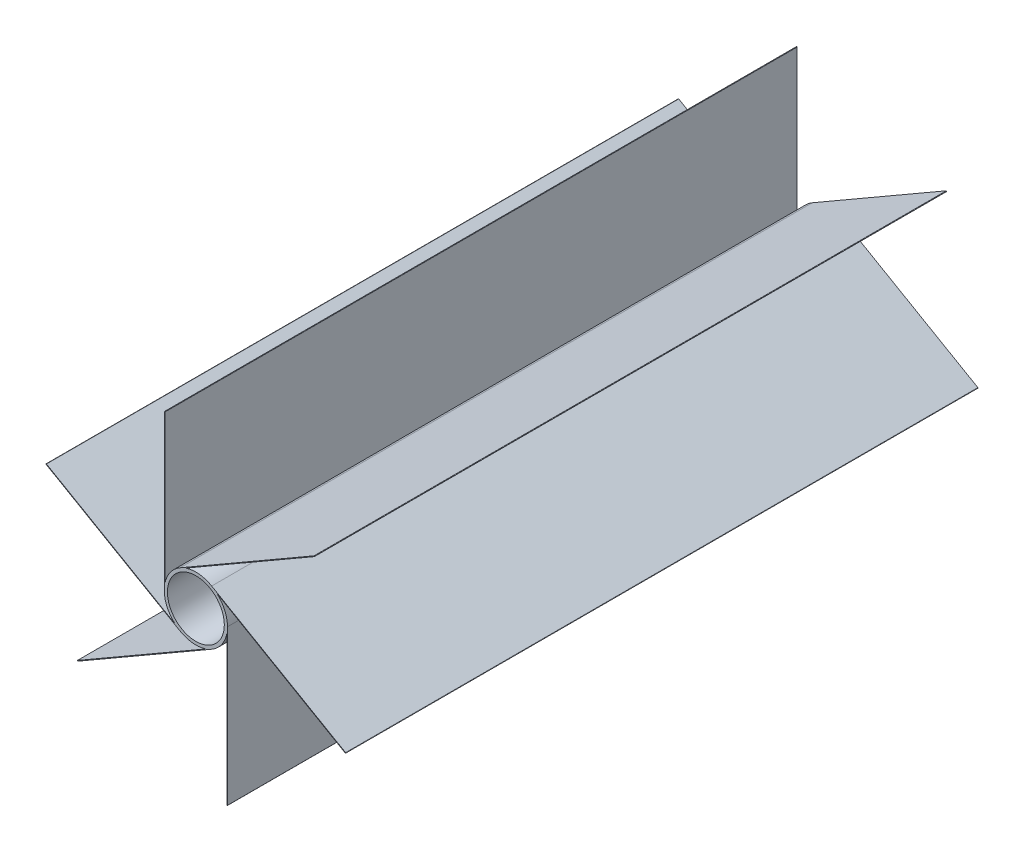
ISO-10303-21;
HEADER;
FILE_DESCRIPTION(('STEP AP214'),'2;1');
FILE_NAME('part.step','',(''),(''),'','','');
FILE_SCHEMA(('AUTOMOTIVE_DESIGN { 1 0 10303 214 1 1 1 1 }'));
ENDSEC;
DATA;
#1=APPLICATION_CONTEXT('core data for automotive mechanical design processes');
#2=APPLICATION_PROTOCOL_DEFINITION('international standard','automotive_design',2000,#1);
#3=PRODUCT_CONTEXT('',#1,'mechanical');
#4=PRODUCT('Part','Part','',(#3));
#5=PRODUCT_RELATED_PRODUCT_CATEGORY('part','',(#4));
#6=PRODUCT_DEFINITION_FORMATION('','',#4);
#7=PRODUCT_DEFINITION_CONTEXT('part definition',#1,'design');
#8=PRODUCT_DEFINITION('design','',#6,#7);
#9=PRODUCT_DEFINITION_SHAPE('','',#8);
#10=(LENGTH_UNIT() NAMED_UNIT(*) SI_UNIT(.MILLI.,.METRE.));
#11=(NAMED_UNIT(*) PLANE_ANGLE_UNIT() SI_UNIT($,.RADIAN.));
#12=(NAMED_UNIT(*) SI_UNIT($,.STERADIAN.) SOLID_ANGLE_UNIT());
#13=UNCERTAINTY_MEASURE_WITH_UNIT(LENGTH_MEASURE(1.E-05),#10,'distance_accuracy_value','');
#14=(GEOMETRIC_REPRESENTATION_CONTEXT(3) GLOBAL_UNCERTAINTY_ASSIGNED_CONTEXT((#13)) GLOBAL_UNIT_ASSIGNED_CONTEXT((#10,
#11,#12)) REPRESENTATION_CONTEXT('',''));
#15=CARTESIAN_POINT('',(0.,0.,0.));
#16=DIRECTION('',(0.,0.,1.));
#17=DIRECTION('',(1.,0.,0.));
#18=AXIS2_PLACEMENT_3D('',#15,#16,#17);
#19=CARTESIAN_POINT('',(0.,0.,-75.));
#20=DIRECTION('',(0.,0.,1.));
#21=DIRECTION('',(1.,0.,0.));
#22=AXIS2_PLACEMENT_3D('',#19,#20,#21);
#23=CYLINDRICAL_SURFACE('',#22,10.);
#24=CARTESIAN_POINT('',(0.,0.,-75.));
#25=DIRECTION('',(0.,0.,-1.));
#26=DIRECTION('',(-1.,0.,0.));
#27=AXIS2_PLACEMENT_3D('',#24,#25,#26);
#28=CIRCLE('',#27,10.);
#29=CARTESIAN_POINT('',(-10.,0.,-75.));
#30=VERTEX_POINT('',#29);
#31=EDGE_CURVE('E11',#30,#30,#28,.T.);
#32=ORIENTED_EDGE('',*,*,#31,.F.);
#33=EDGE_LOOP('',(#32));
#34=FACE_BOUND('',#33,.T.);
#35=CARTESIAN_POINT('',(0.,0.,-27.));
#36=DIRECTION('',(0.,0.,-1.));
#37=DIRECTION('',(-1.,0.,0.));
#38=AXIS2_PLACEMENT_3D('',#35,#36,#37);
#39=CIRCLE('',#38,10.);
#40=CARTESIAN_POINT('',(-10.,0.,-27.));
#41=VERTEX_POINT('',#40);
#42=EDGE_CURVE('E51',#41,#41,#39,.T.);
#43=ORIENTED_EDGE('',*,*,#42,.T.);
#44=EDGE_LOOP('',(#43));
#45=FACE_BOUND('',#44,.T.);
#46=ADVANCED_FACE('F48',(#34,#45),#23,.T.);
#47=CARTESIAN_POINT('',(0.,0.,-75.));
#48=DIRECTION('',(0.,0.,-1.));
#49=DIRECTION('',(-1.,0.,0.));
#50=AXIS2_PLACEMENT_3D('',#47,#48,#49);
#51=PLANE('',#50);
#52=ORIENTED_EDGE('',*,*,#31,.T.);
#53=EDGE_LOOP('',(#52));
#54=FACE_BOUND('',#53,.T.);
#55=ADVANCED_FACE('F63',(#54),#51,.T.);
#56=CARTESIAN_POINT('',(0.,0.,-27.));
#57=DIRECTION('',(0.,0.,-1.));
#58=DIRECTION('',(-1.,0.,0.));
#59=AXIS2_PLACEMENT_3D('',#56,#57,#58);
#60=PLANE('',#59);
#61=ORIENTED_EDGE('',*,*,#42,.F.);
#62=EDGE_LOOP('',(#61));
#63=FACE_BOUND('',#62,.T.);
#64=ADVANCED_FACE('F61',(#63),#60,.F.);
#65=CLOSED_SHELL('',(#46,#55,#64));
#66=MANIFOLD_SOLID_BREP('B2',#65);
#67=CARTESIAN_POINT('',(0.,0.,-27.));
#68=DIRECTION('',(0.,0.,1.));
#69=DIRECTION('',(1.,0.,0.));
#70=AXIS2_PLACEMENT_3D('',#67,#68,#69);
#71=CYLINDRICAL_SURFACE('',#70,12.5);
#72=CARTESIAN_POINT('',(0.,0.,-27.));
#73=DIRECTION('',(0.,0.,-1.));
#74=DIRECTION('',(-1.,0.,0.));
#75=AXIS2_PLACEMENT_3D('',#72,#73,#74);
#76=CIRCLE('',#75,12.5);
#77=CARTESIAN_POINT('',(-12.5,0.,-27.));
#78=VERTEX_POINT('',#77);
#79=EDGE_CURVE('E47',#78,#78,#76,.T.);
#80=ORIENTED_EDGE('',*,*,#79,.F.);
#81=EDGE_LOOP('',(#80));
#82=FACE_BOUND('',#81,.T.);
#83=CARTESIAN_POINT('',(0.,0.,0.));
#84=DIRECTION('',(0.,0.,-1.));
#85=DIRECTION('',(-1.,0.,0.));
#86=AXIS2_PLACEMENT_3D('',#83,#84,#85);
#87=CIRCLE('',#86,12.5);
#88=CARTESIAN_POINT('',(-12.5,0.,0.));
#89=VERTEX_POINT('',#88);
#90=EDGE_CURVE('E103',#89,#89,#87,.T.);
#91=ORIENTED_EDGE('',*,*,#90,.T.);
#92=EDGE_LOOP('',(#91));
#93=FACE_BOUND('',#92,.T.);
#94=ADVANCED_FACE('F100',(#82,#93),#71,.T.);
#95=CARTESIAN_POINT('',(0.,0.,-27.));
#96=DIRECTION('',(0.,0.,-1.));
#97=DIRECTION('',(-1.,0.,0.));
#98=AXIS2_PLACEMENT_3D('',#95,#96,#97);
#99=PLANE('',#98);
#100=ORIENTED_EDGE('',*,*,#79,.T.);
#101=EDGE_LOOP('',(#100));
#102=FACE_BOUND('',#101,.T.);
#103=ADVANCED_FACE('F131',(#102),#99,.T.);
#104=CARTESIAN_POINT('',(0.,0.,10.));
#105=DIRECTION('',(0.,0.,-1.));
#106=DIRECTION('',(-1.,0.,0.));
#107=AXIS2_PLACEMENT_3D('',#104,#105,#106);
#108=CYLINDRICAL_SURFACE('',#107,45.);
#109=CARTESIAN_POINT('',(0.,0.,10.));
#110=DIRECTION('',(0.,0.,-1.));
#111=DIRECTION('',(-1.,0.,0.));
#112=AXIS2_PLACEMENT_3D('',#109,#110,#111);
#113=CIRCLE('',#112,45.);
#114=CARTESIAN_POINT('',(-45.,0.,10.));
#115=VERTEX_POINT('',#114);
#116=EDGE_CURVE('E110',#115,#115,#113,.T.);
#117=ORIENTED_EDGE('',*,*,#116,.T.);
#118=EDGE_LOOP('',(#117));
#119=FACE_BOUND('',#118,.T.);
#120=CARTESIAN_POINT('',(0.,0.,0.));
#121=DIRECTION('',(0.,0.,-1.));
#122=DIRECTION('',(-1.,0.,0.));
#123=AXIS2_PLACEMENT_3D('',#120,#121,#122);
#124=CIRCLE('',#123,45.);
#125=CARTESIAN_POINT('',(-45.,0.,0.));
#126=VERTEX_POINT('',#125);
#127=EDGE_CURVE('E112',#126,#126,#124,.T.);
#128=ORIENTED_EDGE('',*,*,#127,.F.);
#129=EDGE_LOOP('',(#128));
#130=FACE_BOUND('',#129,.T.);
#131=ADVANCED_FACE('F118',(#119,#130),#108,.T.);
#132=CARTESIAN_POINT('',(0.,0.,10.));
#133=DIRECTION('',(0.,0.,-1.));
#134=DIRECTION('',(-1.,0.,0.));
#135=AXIS2_PLACEMENT_3D('',#132,#133,#134);
#136=PLANE('',#135);
#137=ORIENTED_EDGE('',*,*,#116,.F.);
#138=EDGE_LOOP('',(#137));
#139=FACE_BOUND('',#138,.T.);
#140=ADVANCED_FACE('F121',(#139),#136,.F.);
#141=CARTESIAN_POINT('',(0.,0.,0.));
#142=DIRECTION('',(0.,0.,-1.));
#143=DIRECTION('',(-1.,0.,0.));
#144=AXIS2_PLACEMENT_3D('',#141,#142,#143);
#145=PLANE('',#144);
#146=ORIENTED_EDGE('',*,*,#90,.F.);
#147=EDGE_LOOP('',(#146));
#148=FACE_BOUND('',#147,.T.);
#149=ORIENTED_EDGE('',*,*,#127,.T.);
#150=EDGE_LOOP('',(#149));
#151=FACE_BOUND('',#150,.T.);
#152=ADVANCED_FACE('F123',(#148,#151),#145,.T.);
#153=CLOSED_SHELL('',(#94,#103,#131,#140,#152));
#154=MANIFOLD_SOLID_BREP('B6',#153);
#155=CARTESIAN_POINT('',(-49.5,244.54038521275,1000.));
#156=DIRECTION('',(0.,0.,1.));
#157=DIRECTION('',(1.,0.,0.));
#158=AXIS2_PLACEMENT_3D('',#155,#156,#157);
#159=PLANE('',#158);
#160=CARTESIAN_POINT('',(-49.5,244.54038521275,1000.));
#161=DIRECTION('',(0.,0.,1.));
#162=DIRECTION('',(1.,0.,0.));
#163=AXIS2_PLACEMENT_3D('',#160,#161,#162);
#164=CIRCLE('',#163,0.500000000000004);
#165=CARTESIAN_POINT('',(-49.,244.54038521275,1000.));
#166=VERTEX_POINT('',#165);
#167=CARTESIAN_POINT('',(-50.,244.54038521275,1000.));
#168=VERTEX_POINT('',#167);
#169=EDGE_CURVE('E413',#166,#168,#164,.T.);
#170=ORIENTED_EDGE('',*,*,#169,.T.);
#171=DIRECTION('',(0.,-1.,0.));
#172=VECTOR('',#171,1.);
#173=CARTESIAN_POINT('',(-50.,0.,1000.));
#174=LINE('',#173,#172);
#175=CARTESIAN_POINT('',(-50.,0.,1000.));
#176=VERTEX_POINT('',#175);
#177=EDGE_CURVE('E281',#168,#176,#174,.T.);
#178=ORIENTED_EDGE('',*,*,#177,.T.);
#179=CARTESIAN_POINT('',(0.,0.,1000.));
#180=DIRECTION('',(0.,0.,1.));
#181=DIRECTION('',(1.,0.,0.));
#182=AXIS2_PLACEMENT_3D('',#179,#180,#181);
#183=CIRCLE('',#182,50.);
#184=CARTESIAN_POINT('',(-33.116843969807,-37.4603075999044,1000.));
#185=VERTEX_POINT('',#184);
#186=EDGE_CURVE('E476',#176,#185,#183,.T.);
#187=ORIENTED_EDGE('',*,*,#186,.T.);
#188=DIRECTION('',(-0.866025403784439,0.499999999999999,0.));
#189=VECTOR('',#188,1.);
#190=CARTESIAN_POINT('',(-33.116843969807,-37.4603075999044,1000.));
#191=LINE('',#190,#189);
#192=CARTESIAN_POINT('',(-236.278185845474,79.8349478209371,1000.));
#193=VERTEX_POINT('',#192);
#194=EDGE_CURVE('E495',#185,#193,#191,.T.);
#195=ORIENTED_EDGE('',*,*,#194,.T.);
#196=CARTESIAN_POINT('',(-236.528185845474,79.4019351190449,1000.));
#197=DIRECTION('',(0.,0.,1.));
#198=DIRECTION('',(1.,0.,0.));
#199=AXIS2_PLACEMENT_3D('',#196,#197,#198);
#200=CIRCLE('',#199,0.500000000000009);
#201=CARTESIAN_POINT('',(-236.778185845474,78.9689224171527,1000.));
#202=VERTEX_POINT('',#201);
#203=EDGE_CURVE('E492',#193,#202,#200,.T.);
#204=ORIENTED_EDGE('',*,*,#203,.T.);
#205=DIRECTION('',(0.866025403784439,-0.499999999999999,0.));
#206=VECTOR('',#205,1.);
#207=CARTESIAN_POINT('',(-25.,-43.301270189222,1000.));
#208=LINE('',#207,#206);
#209=CARTESIAN_POINT('',(-25.,-43.3012701892219,1000.));
#210=VERTEX_POINT('',#209);
#211=EDGE_CURVE('E494',#202,#210,#208,.T.);
#212=ORIENTED_EDGE('',*,*,#211,.T.);
#213=CARTESIAN_POINT('',(0.,0.,1000.));
#214=DIRECTION('',(0.,0.,1.));
#215=DIRECTION('',(1.,0.,0.));
#216=AXIS2_PLACEMENT_3D('',#213,#214,#215);
#217=CIRCLE('',#216,50.);
#218=CARTESIAN_POINT('',(15.883156030193,-47.4101819709706,1000.));
#219=VERTEX_POINT('',#218);
#220=EDGE_CURVE('E497',#210,#219,#217,.T.);
#221=ORIENTED_EDGE('',*,*,#220,.T.);
#222=DIRECTION('',(-0.866025403784438,-0.5,0.));
#223=VECTOR('',#222,1.);
#224=CARTESIAN_POINT('',(15.883156030193,-47.4101819709706,1000.));
#225=LINE('',#224,#223);
#226=CARTESIAN_POINT('',(-187.278185845474,-164.705437391812,1000.));
#227=VERTEX_POINT('',#226);
#228=EDGE_CURVE('E503',#219,#227,#225,.T.);
#229=ORIENTED_EDGE('',*,*,#228,.T.);
#230=CARTESIAN_POINT('',(-187.028185845474,-165.138450093705,1000.));
#231=DIRECTION('',(0.,0.,1.));
#232=DIRECTION('',(1.,0.,0.));
#233=AXIS2_PLACEMENT_3D('',#230,#231,#232);
#234=CIRCLE('',#233,0.500000000000021);
#235=CARTESIAN_POINT('',(-186.778185845474,-165.571462795597,1000.));
#236=VERTEX_POINT('',#235);
#237=EDGE_CURVE('E505',#227,#236,#234,.T.);
#238=ORIENTED_EDGE('',*,*,#237,.T.);
#239=DIRECTION('',(0.866025403784438,0.500000000000001,0.));
#240=VECTOR('',#239,1.);
#241=CARTESIAN_POINT('',(25.,-43.3012701892219,1000.));
#242=LINE('',#241,#240);
#243=CARTESIAN_POINT('',(25.,-43.3012701892219,1000.));
#244=VERTEX_POINT('',#243);
#245=EDGE_CURVE('E507',#236,#244,#242,.T.);
#246=ORIENTED_EDGE('',*,*,#245,.T.);
#247=CARTESIAN_POINT('',(0.,0.,1000.));
#248=DIRECTION('',(0.,0.,1.));
#249=DIRECTION('',(1.,0.,0.));
#250=AXIS2_PLACEMENT_3D('',#247,#248,#249);
#251=CIRCLE('',#250,50.);
#252=CARTESIAN_POINT('',(49.,-9.9498743710662,1000.));
#253=VERTEX_POINT('',#252);
#254=EDGE_CURVE('E509',#244,#253,#251,.T.);
#255=ORIENTED_EDGE('',*,*,#254,.T.);
#256=DIRECTION('',(0.,-1.,0.));
#257=VECTOR('',#256,1.);
#258=CARTESIAN_POINT('',(49.,-9.9498743710662,1000.));
#259=LINE('',#258,#257);
#260=CARTESIAN_POINT('',(49.,-244.54038521275,1000.));
#261=VERTEX_POINT('',#260);
#262=EDGE_CURVE('E511',#253,#261,#259,.T.);
#263=ORIENTED_EDGE('',*,*,#262,.T.);
#264=CARTESIAN_POINT('',(49.5,-244.54038521275,1000.));
#265=DIRECTION('',(0.,0.,1.));
#266=DIRECTION('',(1.,0.,0.));
#267=AXIS2_PLACEMENT_3D('',#264,#265,#266);
#268=CIRCLE('',#267,0.500000000000004);
#269=CARTESIAN_POINT('',(50.,-244.54038521275,1000.));
#270=VERTEX_POINT('',#269);
#271=EDGE_CURVE('E513',#261,#270,#268,.T.);
#272=ORIENTED_EDGE('',*,*,#271,.T.);
#273=DIRECTION('',(0.,1.,0.));
#274=VECTOR('',#273,1.);
#275=CARTESIAN_POINT('',(50.,0.,1000.));
#276=LINE('',#275,#274);
#277=CARTESIAN_POINT('',(50.,0.,1000.));
#278=VERTEX_POINT('',#277);
#279=EDGE_CURVE('E515',#270,#278,#276,.T.);
#280=ORIENTED_EDGE('',*,*,#279,.T.);
#281=CARTESIAN_POINT('',(0.,0.,1000.));
#282=DIRECTION('',(0.,0.,1.));
#283=DIRECTION('',(1.,0.,0.));
#284=AXIS2_PLACEMENT_3D('',#281,#282,#283);
#285=CIRCLE('',#284,50.);
#286=CARTESIAN_POINT('',(33.116843969807,37.4603075999044,1000.));
#287=VERTEX_POINT('',#286);
#288=EDGE_CURVE('E517',#278,#287,#285,.T.);
#289=ORIENTED_EDGE('',*,*,#288,.T.);
#290=DIRECTION('',(0.866025403784439,-0.5,0.));
#291=VECTOR('',#290,1.);
#292=CARTESIAN_POINT('',(33.116843969807,37.4603075999044,1000.));
#293=LINE('',#292,#291);
#294=CARTESIAN_POINT('',(236.278185845474,-79.8349478209373,1000.));
#295=VERTEX_POINT('',#294);
#296=EDGE_CURVE('E519',#287,#295,#293,.T.);
#297=ORIENTED_EDGE('',*,*,#296,.T.);
#298=CARTESIAN_POINT('',(236.528185845474,-79.4019351190451,1000.));
#299=DIRECTION('',(0.,0.,1.));
#300=DIRECTION('',(1.,0.,0.));
#301=AXIS2_PLACEMENT_3D('',#298,#299,#300);
#302=CIRCLE('',#301,0.500000000000008);
#303=CARTESIAN_POINT('',(236.778185845474,-78.9689224171528,1000.));
#304=VERTEX_POINT('',#303);
#305=EDGE_CURVE('E521',#295,#304,#302,.T.);
#306=ORIENTED_EDGE('',*,*,#305,.T.);
#307=DIRECTION('',(-0.866025403784439,0.5,0.));
#308=VECTOR('',#307,1.);
#309=CARTESIAN_POINT('',(25.,43.3012701892219,1000.));
#310=LINE('',#309,#308);
#311=CARTESIAN_POINT('',(25.,43.3012701892219,1000.));
#312=VERTEX_POINT('',#311);
#313=EDGE_CURVE('E523',#304,#312,#310,.T.);
#314=ORIENTED_EDGE('',*,*,#313,.T.);
#315=CARTESIAN_POINT('',(0.,0.,1000.));
#316=DIRECTION('',(0.,0.,1.));
#317=DIRECTION('',(1.,0.,0.));
#318=AXIS2_PLACEMENT_3D('',#315,#316,#317);
#319=CIRCLE('',#318,50.);
#320=CARTESIAN_POINT('',(-15.883156030193,47.4101819709706,1000.));
#321=VERTEX_POINT('',#320);
#322=EDGE_CURVE('E525',#312,#321,#319,.T.);
#323=ORIENTED_EDGE('',*,*,#322,.T.);
#324=DIRECTION('',(0.866025403784439,0.5,0.));
#325=VECTOR('',#324,1.);
#326=CARTESIAN_POINT('',(-15.883156030193,47.4101819709706,1000.));
#327=LINE('',#326,#325);
#328=CARTESIAN_POINT('',(187.278185845474,164.705437391812,1000.));
#329=VERTEX_POINT('',#328);
#330=EDGE_CURVE('E527',#321,#329,#327,.T.);
#331=ORIENTED_EDGE('',*,*,#330,.T.);
#332=CARTESIAN_POINT('',(187.028185845474,165.138450093705,1000.));
#333=DIRECTION('',(0.,0.,1.));
#334=DIRECTION('',(1.,0.,0.));
#335=AXIS2_PLACEMENT_3D('',#332,#333,#334);
#336=CIRCLE('',#335,0.500000000000021);
#337=CARTESIAN_POINT('',(186.778185845474,165.571462795597,1000.));
#338=VERTEX_POINT('',#337);
#339=EDGE_CURVE('E348',#329,#338,#336,.T.);
#340=ORIENTED_EDGE('',*,*,#339,.T.);
#341=DIRECTION('',(-0.866025403784438,-0.5,0.));
#342=VECTOR('',#341,1.);
#343=CARTESIAN_POINT('',(-25.,43.3012701892219,1000.));
#344=LINE('',#343,#342);
#345=CARTESIAN_POINT('',(-25.,43.3012701892219,1000.));
#346=VERTEX_POINT('',#345);
#347=EDGE_CURVE('E342',#338,#346,#344,.T.);
#348=ORIENTED_EDGE('',*,*,#347,.T.);
#349=CARTESIAN_POINT('',(0.,0.,1000.));
#350=DIRECTION('',(0.,0.,1.));
#351=DIRECTION('',(1.,0.,0.));
#352=AXIS2_PLACEMENT_3D('',#349,#350,#351);
#353=CIRCLE('',#352,50.);
#354=CARTESIAN_POINT('',(-49.,9.9498743710662,1000.));
#355=VERTEX_POINT('',#354);
#356=EDGE_CURVE('E346',#346,#355,#353,.T.);
#357=ORIENTED_EDGE('',*,*,#356,.T.);
#358=DIRECTION('',(0.,1.,0.));
#359=VECTOR('',#358,1.);
#360=CARTESIAN_POINT('',(-49.,9.9498743710662,1000.));
#361=LINE('',#360,#359);
#362=EDGE_CURVE('E190',#355,#166,#361,.T.);
#363=ORIENTED_EDGE('',*,*,#362,.T.);
#364=EDGE_LOOP('',(#170,#178,#187,#195,#204,#212,#221,#229,#238,#246,#255,#263,#272,#280,#289,
#297,#306,#314,#323,#331,#340,#348,#357,#363));
#365=FACE_BOUND('',#364,.T.);
#366=CARTESIAN_POINT('',(0.,0.,1000.));
#367=DIRECTION('',(0.,0.,1.));
#368=DIRECTION('',(1.,0.,0.));
#369=AXIS2_PLACEMENT_3D('',#366,#367,#368);
#370=CIRCLE('',#369,45.);
#371=CARTESIAN_POINT('',(45.,0.,1000.));
#372=VERTEX_POINT('',#371);
#373=EDGE_CURVE('E370',#372,#372,#370,.T.);
#374=ORIENTED_EDGE('',*,*,#373,.F.);
#375=EDGE_LOOP('',(#374));
#376=FACE_BOUND('',#375,.T.);
#377=ADVANCED_FACE('F173',(#365,#376),#159,.T.);
#378=CARTESIAN_POINT('',(-49.5,244.54038521275,0.));
#379=DIRECTION('',(0.,0.,1.));
#380=DIRECTION('',(1.,0.,0.));
#381=AXIS2_PLACEMENT_3D('',#378,#379,#380);
#382=PLANE('',#381);
#383=CARTESIAN_POINT('',(-49.5,244.54038521275,0.));
#384=DIRECTION('',(0.,0.,1.));
#385=DIRECTION('',(1.,0.,0.));
#386=AXIS2_PLACEMENT_3D('',#383,#384,#385);
#387=CIRCLE('',#386,0.500000000000004);
#388=CARTESIAN_POINT('',(-49.,244.54038521275,0.));
#389=VERTEX_POINT('',#388);
#390=CARTESIAN_POINT('',(-50.,244.54038521275,0.));
#391=VERTEX_POINT('',#390);
#392=EDGE_CURVE('E366',#389,#391,#387,.T.);
#393=ORIENTED_EDGE('',*,*,#392,.F.);
#394=DIRECTION('',(0.,1.,0.));
#395=VECTOR('',#394,1.);
#396=CARTESIAN_POINT('',(-49.,9.9498743710662,0.));
#397=LINE('',#396,#395);
#398=CARTESIAN_POINT('',(-49.,9.9498743710662,0.));
#399=VERTEX_POINT('',#398);
#400=EDGE_CURVE('E273',#399,#389,#397,.T.);
#401=ORIENTED_EDGE('',*,*,#400,.F.);
#402=CARTESIAN_POINT('',(0.,0.,0.));
#403=DIRECTION('',(0.,0.,1.));
#404=DIRECTION('',(1.,0.,0.));
#405=AXIS2_PLACEMENT_3D('',#402,#403,#404);
#406=CIRCLE('',#405,50.);
#407=CARTESIAN_POINT('',(-25.,43.3012701892219,0.));
#408=VERTEX_POINT('',#407);
#409=EDGE_CURVE('E267',#408,#399,#406,.T.);
#410=ORIENTED_EDGE('',*,*,#409,.F.);
#411=DIRECTION('',(-0.866025403784438,-0.5,0.));
#412=VECTOR('',#411,1.);
#413=CARTESIAN_POINT('',(-25.,43.3012701892219,0.));
#414=LINE('',#413,#412);
#415=CARTESIAN_POINT('',(186.778185845474,165.571462795597,0.));
#416=VERTEX_POINT('',#415);
#417=EDGE_CURVE('E356',#416,#408,#414,.T.);
#418=ORIENTED_EDGE('',*,*,#417,.F.);
#419=CARTESIAN_POINT('',(187.028185845474,165.138450093705,0.));
#420=DIRECTION('',(0.,0.,1.));
#421=DIRECTION('',(1.,0.,0.));
#422=AXIS2_PLACEMENT_3D('',#419,#420,#421);
#423=CIRCLE('',#422,0.500000000000021);
#424=CARTESIAN_POINT('',(187.278185845474,164.705437391812,0.));
#425=VERTEX_POINT('',#424);
#426=EDGE_CURVE('E408',#425,#416,#423,.T.);
#427=ORIENTED_EDGE('',*,*,#426,.F.);
#428=DIRECTION('',(0.866025403784439,0.5,0.));
#429=VECTOR('',#428,1.);
#430=CARTESIAN_POINT('',(-15.883156030193,47.4101819709706,0.));
#431=LINE('',#430,#429);
#432=CARTESIAN_POINT('',(-15.883156030193,47.4101819709706,0.));
#433=VERTEX_POINT('',#432);
#434=EDGE_CURVE('E406',#433,#425,#431,.T.);
#435=ORIENTED_EDGE('',*,*,#434,.F.);
#436=CARTESIAN_POINT('',(0.,0.,0.));
#437=DIRECTION('',(0.,0.,1.));
#438=DIRECTION('',(1.,0.,0.));
#439=AXIS2_PLACEMENT_3D('',#436,#437,#438);
#440=CIRCLE('',#439,50.);
#441=CARTESIAN_POINT('',(25.,43.3012701892219,0.));
#442=VERTEX_POINT('',#441);
#443=EDGE_CURVE('E404',#442,#433,#440,.T.);
#444=ORIENTED_EDGE('',*,*,#443,.F.);
#445=DIRECTION('',(-0.866025403784439,0.5,0.));
#446=VECTOR('',#445,1.);
#447=CARTESIAN_POINT('',(25.,43.3012701892219,0.));
#448=LINE('',#447,#446);
#449=CARTESIAN_POINT('',(236.778185845474,-78.9689224171528,0.));
#450=VERTEX_POINT('',#449);
#451=EDGE_CURVE('E402',#450,#442,#448,.T.);
#452=ORIENTED_EDGE('',*,*,#451,.F.);
#453=CARTESIAN_POINT('',(236.528185845474,-79.4019351190451,0.));
#454=DIRECTION('',(0.,0.,1.));
#455=DIRECTION('',(1.,0.,0.));
#456=AXIS2_PLACEMENT_3D('',#453,#454,#455);
#457=CIRCLE('',#456,0.500000000000008);
#458=CARTESIAN_POINT('',(236.278185845474,-79.8349478209373,0.));
#459=VERTEX_POINT('',#458);
#460=EDGE_CURVE('E400',#459,#450,#457,.T.);
#461=ORIENTED_EDGE('',*,*,#460,.F.);
#462=DIRECTION('',(0.866025403784439,-0.5,0.));
#463=VECTOR('',#462,1.);
#464=CARTESIAN_POINT('',(33.116843969807,37.4603075999044,0.));
#465=LINE('',#464,#463);
#466=CARTESIAN_POINT('',(33.116843969807,37.4603075999044,0.));
#467=VERTEX_POINT('',#466);
#468=EDGE_CURVE('E398',#467,#459,#465,.T.);
#469=ORIENTED_EDGE('',*,*,#468,.F.);
#470=CARTESIAN_POINT('',(0.,0.,0.));
#471=DIRECTION('',(0.,0.,1.));
#472=DIRECTION('',(1.,0.,0.));
#473=AXIS2_PLACEMENT_3D('',#470,#471,#472);
#474=CIRCLE('',#473,50.);
#475=CARTESIAN_POINT('',(50.,0.,0.));
#476=VERTEX_POINT('',#475);
#477=EDGE_CURVE('E396',#476,#467,#474,.T.);
#478=ORIENTED_EDGE('',*,*,#477,.F.);
#479=DIRECTION('',(0.,1.,0.));
#480=VECTOR('',#479,1.);
#481=CARTESIAN_POINT('',(50.,0.,0.));
#482=LINE('',#481,#480);
#483=CARTESIAN_POINT('',(50.,-244.54038521275,0.));
#484=VERTEX_POINT('',#483);
#485=EDGE_CURVE('E394',#484,#476,#482,.T.);
#486=ORIENTED_EDGE('',*,*,#485,.F.);
#487=CARTESIAN_POINT('',(49.5,-244.54038521275,0.));
#488=DIRECTION('',(0.,0.,1.));
#489=DIRECTION('',(1.,0.,0.));
#490=AXIS2_PLACEMENT_3D('',#487,#488,#489);
#491=CIRCLE('',#490,0.500000000000004);
#492=CARTESIAN_POINT('',(49.,-244.54038521275,0.));
#493=VERTEX_POINT('',#492);
#494=EDGE_CURVE('E392',#493,#484,#491,.T.);
#495=ORIENTED_EDGE('',*,*,#494,.F.);
#496=DIRECTION('',(0.,-1.,0.));
#497=VECTOR('',#496,1.);
#498=CARTESIAN_POINT('',(49.,-9.9498743710662,0.));
#499=LINE('',#498,#497);
#500=CARTESIAN_POINT('',(49.,-9.9498743710662,0.));
#501=VERTEX_POINT('',#500);
#502=EDGE_CURVE('E390',#501,#493,#499,.T.);
#503=ORIENTED_EDGE('',*,*,#502,.F.);
#504=CARTESIAN_POINT('',(0.,0.,0.));
#505=DIRECTION('',(0.,0.,1.));
#506=DIRECTION('',(1.,0.,0.));
#507=AXIS2_PLACEMENT_3D('',#504,#505,#506);
#508=CIRCLE('',#507,50.);
#509=CARTESIAN_POINT('',(25.,-43.3012701892219,0.));
#510=VERTEX_POINT('',#509);
#511=EDGE_CURVE('E388',#510,#501,#508,.T.);
#512=ORIENTED_EDGE('',*,*,#511,.F.);
#513=DIRECTION('',(0.866025403784438,0.500000000000001,0.));
#514=VECTOR('',#513,1.);
#515=CARTESIAN_POINT('',(25.,-43.3012701892219,0.));
#516=LINE('',#515,#514);
#517=CARTESIAN_POINT('',(-186.778185845474,-165.571462795597,0.));
#518=VERTEX_POINT('',#517);
#519=EDGE_CURVE('E386',#518,#510,#516,.T.);
#520=ORIENTED_EDGE('',*,*,#519,.F.);
#521=CARTESIAN_POINT('',(-187.028185845474,-165.138450093705,0.));
#522=DIRECTION('',(0.,0.,1.));
#523=DIRECTION('',(1.,0.,0.));
#524=AXIS2_PLACEMENT_3D('',#521,#522,#523);
#525=CIRCLE('',#524,0.500000000000021);
#526=CARTESIAN_POINT('',(-187.278185845474,-164.705437391812,0.));
#527=VERTEX_POINT('',#526);
#528=EDGE_CURVE('E384',#527,#518,#525,.T.);
#529=ORIENTED_EDGE('',*,*,#528,.F.);
#530=DIRECTION('',(-0.866025403784438,-0.5,0.));
#531=VECTOR('',#530,1.);
#532=CARTESIAN_POINT('',(15.883156030193,-47.4101819709706,0.));
#533=LINE('',#532,#531);
#534=CARTESIAN_POINT('',(15.883156030193,-47.4101819709706,0.));
#535=VERTEX_POINT('',#534);
#536=EDGE_CURVE('E382',#535,#527,#533,.T.);
#537=ORIENTED_EDGE('',*,*,#536,.F.);
#538=CARTESIAN_POINT('',(0.,0.,0.));
#539=DIRECTION('',(0.,0.,1.));
#540=DIRECTION('',(1.,0.,0.));
#541=AXIS2_PLACEMENT_3D('',#538,#539,#540);
#542=CIRCLE('',#541,50.);
#543=CARTESIAN_POINT('',(-25.,-43.3012701892219,0.));
#544=VERTEX_POINT('',#543);
#545=EDGE_CURVE('E380',#544,#535,#542,.T.);
#546=ORIENTED_EDGE('',*,*,#545,.F.);
#547=DIRECTION('',(0.866025403784439,-0.499999999999999,0.));
#548=VECTOR('',#547,1.);
#549=CARTESIAN_POINT('',(-25.,-43.301270189222,0.));
#550=LINE('',#549,#548);
#551=CARTESIAN_POINT('',(-236.778185845474,78.9689224171527,0.));
#552=VERTEX_POINT('',#551);
#553=EDGE_CURVE('E378',#552,#544,#550,.T.);
#554=ORIENTED_EDGE('',*,*,#553,.F.);
#555=CARTESIAN_POINT('',(-236.528185845474,79.4019351190449,0.));
#556=DIRECTION('',(0.,0.,1.));
#557=DIRECTION('',(1.,0.,0.));
#558=AXIS2_PLACEMENT_3D('',#555,#556,#557);
#559=CIRCLE('',#558,0.500000000000009);
#560=CARTESIAN_POINT('',(-236.278185845474,79.8349478209371,0.));
#561=VERTEX_POINT('',#560);
#562=EDGE_CURVE('E376',#561,#552,#559,.T.);
#563=ORIENTED_EDGE('',*,*,#562,.F.);
#564=DIRECTION('',(-0.866025403784439,0.499999999999999,0.));
#565=VECTOR('',#564,1.);
#566=CARTESIAN_POINT('',(-33.116843969807,-37.4603075999044,0.));
#567=LINE('',#566,#565);
#568=CARTESIAN_POINT('',(-33.116843969807,-37.4603075999044,0.));
#569=VERTEX_POINT('',#568);
#570=EDGE_CURVE('E374',#569,#561,#567,.T.);
#571=ORIENTED_EDGE('',*,*,#570,.F.);
#572=CARTESIAN_POINT('',(0.,0.,0.));
#573=DIRECTION('',(0.,0.,1.));
#574=DIRECTION('',(1.,0.,0.));
#575=AXIS2_PLACEMENT_3D('',#572,#573,#574);
#576=CIRCLE('',#575,50.);
#577=CARTESIAN_POINT('',(-50.,0.,0.));
#578=VERTEX_POINT('',#577);
#579=EDGE_CURVE('E372',#578,#569,#576,.T.);
#580=ORIENTED_EDGE('',*,*,#579,.F.);
#581=DIRECTION('',(0.,-1.,0.));
#582=VECTOR('',#581,1.);
#583=CARTESIAN_POINT('',(-50.,0.,0.));
#584=LINE('',#583,#582);
#585=EDGE_CURVE('E369',#391,#578,#584,.T.);
#586=ORIENTED_EDGE('',*,*,#585,.F.);
#587=EDGE_LOOP('',(#393,#401,#410,#418,#427,#435,#444,#452,#461,#469,#478,#486,#495,#503,#512,
#520,#529,#537,#546,#554,#563,#571,#580,#586));
#588=FACE_BOUND('',#587,.T.);
#589=CARTESIAN_POINT('',(0.,0.,0.));
#590=DIRECTION('',(0.,0.,1.));
#591=DIRECTION('',(1.,0.,0.));
#592=AXIS2_PLACEMENT_3D('',#589,#590,#591);
#593=CIRCLE('',#592,45.);
#594=CARTESIAN_POINT('',(45.,0.,0.));
#595=VERTEX_POINT('',#594);
#596=EDGE_CURVE('E831',#595,#595,#593,.T.);
#597=ORIENTED_EDGE('',*,*,#596,.T.);
#598=EDGE_LOOP('',(#597));
#599=FACE_BOUND('',#598,.T.);
#600=ADVANCED_FACE('F480',(#588,#599),#382,.F.);
#601=CARTESIAN_POINT('',(-49.5,244.54038521275,1000.));
#602=DIRECTION('',(0.,0.,-1.));
#603=DIRECTION('',(-1.,0.,0.));
#604=AXIS2_PLACEMENT_3D('',#601,#602,#603);
#605=CYLINDRICAL_SURFACE('',#604,0.500000000000004);
#606=ORIENTED_EDGE('',*,*,#392,.T.);
#607=DIRECTION('',(0.,0.,-1.));
#608=VECTOR('',#607,1.);
#609=CARTESIAN_POINT('',(-50.,244.54038521275,1000.));
#610=LINE('',#609,#608);
#611=EDGE_CURVE('E98',#168,#391,#610,.T.);
#612=ORIENTED_EDGE('',*,*,#611,.F.);
#613=ORIENTED_EDGE('',*,*,#169,.F.);
#614=DIRECTION('',(0.,0.,-1.));
#615=VECTOR('',#614,1.);
#616=CARTESIAN_POINT('',(-49.,244.54038521275,1000.));
#617=LINE('',#616,#615);
#618=EDGE_CURVE('E362',#166,#389,#617,.T.);
#619=ORIENTED_EDGE('',*,*,#618,.T.);
#620=EDGE_LOOP('',(#606,#612,#613,#619));
#621=FACE_BOUND('',#620,.T.);
#622=ADVANCED_FACE('F175',(#621),#605,.T.);
#623=CARTESIAN_POINT('',(-50.,0.,1000.));
#624=DIRECTION('',(1.,0.,0.));
#625=DIRECTION('',(0.,0.,-1.));
#626=AXIS2_PLACEMENT_3D('',#623,#624,#625);
#627=PLANE('',#626);
#628=ORIENTED_EDGE('',*,*,#585,.T.);
#629=DIRECTION('',(0.,0.,-1.));
#630=VECTOR('',#629,1.);
#631=CARTESIAN_POINT('',(-50.,0.,1000.));
#632=LINE('',#631,#630);
#633=EDGE_CURVE('E182',#176,#578,#632,.T.);
#634=ORIENTED_EDGE('',*,*,#633,.F.);
#635=ORIENTED_EDGE('',*,*,#177,.F.);
#636=ORIENTED_EDGE('',*,*,#611,.T.);
#637=EDGE_LOOP('',(#628,#634,#635,#636));
#638=FACE_BOUND('',#637,.T.);
#639=ADVANCED_FACE('F561',(#638),#627,.F.);
#640=CARTESIAN_POINT('',(0.,0.,1000.));
#641=DIRECTION('',(0.,0.,-1.));
#642=DIRECTION('',(-1.,0.,0.));
#643=AXIS2_PLACEMENT_3D('',#640,#641,#642);
#644=CYLINDRICAL_SURFACE('',#643,50.);
#645=ORIENTED_EDGE('',*,*,#579,.T.);
#646=DIRECTION('',(0.,0.,-1.));
#647=VECTOR('',#646,1.);
#648=CARTESIAN_POINT('',(-33.116843969807,-37.4603075999044,1000.));
#649=LINE('',#648,#647);
#650=EDGE_CURVE('E468',#185,#569,#649,.T.);
#651=ORIENTED_EDGE('',*,*,#650,.F.);
#652=ORIENTED_EDGE('',*,*,#186,.F.);
#653=ORIENTED_EDGE('',*,*,#633,.T.);
#654=EDGE_LOOP('',(#645,#651,#652,#653));
#655=FACE_BOUND('',#654,.T.);
#656=ADVANCED_FACE('F474',(#655),#644,.T.);
#657=CARTESIAN_POINT('',(-33.116843969807,-37.4603075999044,1000.));
#658=DIRECTION('',(-0.499999999999999,-0.866025403784439,0.));
#659=DIRECTION('',(0.866025403784439,-0.499999999999999,0.));
#660=AXIS2_PLACEMENT_3D('',#657,#658,#659);
#661=PLANE('',#660);
#662=ORIENTED_EDGE('',*,*,#570,.T.);
#663=DIRECTION('',(0.,0.,-1.));
#664=VECTOR('',#663,1.);
#665=CARTESIAN_POINT('',(-236.278185845474,79.8349478209371,1000.));
#666=LINE('',#665,#664);
#667=EDGE_CURVE('E465',#193,#561,#666,.T.);
#668=ORIENTED_EDGE('',*,*,#667,.F.);
#669=ORIENTED_EDGE('',*,*,#194,.F.);
#670=ORIENTED_EDGE('',*,*,#650,.T.);
#671=EDGE_LOOP('',(#662,#668,#669,#670));
#672=FACE_BOUND('',#671,.T.);
#673=ADVANCED_FACE('F486',(#672),#661,.F.);
#674=CARTESIAN_POINT('',(-236.528185845474,79.4019351190449,1000.));
#675=DIRECTION('',(0.,0.,-1.));
#676=DIRECTION('',(-1.,0.,0.));
#677=AXIS2_PLACEMENT_3D('',#674,#675,#676);
#678=CYLINDRICAL_SURFACE('',#677,0.500000000000009);
#679=ORIENTED_EDGE('',*,*,#562,.T.);
#680=DIRECTION('',(0.,0.,-1.));
#681=VECTOR('',#680,1.);
#682=CARTESIAN_POINT('',(-236.778185845474,78.9689224171527,1000.));
#683=LINE('',#682,#681);
#684=EDGE_CURVE('E462',#202,#552,#683,.T.);
#685=ORIENTED_EDGE('',*,*,#684,.F.);
#686=ORIENTED_EDGE('',*,*,#203,.F.);
#687=ORIENTED_EDGE('',*,*,#667,.T.);
#688=EDGE_LOOP('',(#679,#685,#686,#687));
#689=FACE_BOUND('',#688,.T.);
#690=ADVANCED_FACE('F490',(#689),#678,.T.);
#691=CARTESIAN_POINT('',(-25.,-43.301270189222,1000.));
#692=DIRECTION('',(0.499999999999999,0.866025403784439,0.));
#693=DIRECTION('',(-0.866025403784439,0.499999999999999,0.));
#694=AXIS2_PLACEMENT_3D('',#691,#692,#693);
#695=PLANE('',#694);
#696=ORIENTED_EDGE('',*,*,#553,.T.);
#697=DIRECTION('',(0.,0.,-1.));
#698=VECTOR('',#697,1.);
#699=CARTESIAN_POINT('',(-25.,-43.3012701892219,1000.));
#700=LINE('',#699,#698);
#701=EDGE_CURVE('E459',#210,#544,#700,.T.);
#702=ORIENTED_EDGE('',*,*,#701,.F.);
#703=ORIENTED_EDGE('',*,*,#211,.F.);
#704=ORIENTED_EDGE('',*,*,#684,.T.);
#705=EDGE_LOOP('',(#696,#702,#703,#704));
#706=FACE_BOUND('',#705,.T.);
#707=ADVANCED_FACE('F574',(#706),#695,.F.);
#708=CARTESIAN_POINT('',(0.,0.,1000.));
#709=DIRECTION('',(0.,0.,-1.));
#710=DIRECTION('',(-1.,0.,0.));
#711=AXIS2_PLACEMENT_3D('',#708,#709,#710);
#712=CYLINDRICAL_SURFACE('',#711,50.);
#713=ORIENTED_EDGE('',*,*,#545,.T.);
#714=DIRECTION('',(0.,0.,-1.));
#715=VECTOR('',#714,1.);
#716=CARTESIAN_POINT('',(15.883156030193,-47.4101819709706,1000.));
#717=LINE('',#716,#715);
#718=EDGE_CURVE('E456',#219,#535,#717,.T.);
#719=ORIENTED_EDGE('',*,*,#718,.F.);
#720=ORIENTED_EDGE('',*,*,#220,.F.);
#721=ORIENTED_EDGE('',*,*,#701,.T.);
#722=EDGE_LOOP('',(#713,#719,#720,#721));
#723=FACE_BOUND('',#722,.T.);
#724=ADVANCED_FACE('F577',(#723),#712,.T.);
#725=CARTESIAN_POINT('',(15.883156030193,-47.4101819709706,1000.));
#726=DIRECTION('',(0.5,-0.866025403784439,0.));
#727=DIRECTION('',(0.866025403784438,0.5,0.));
#728=AXIS2_PLACEMENT_3D('',#725,#726,#727);
#729=PLANE('',#728);
#730=ORIENTED_EDGE('',*,*,#536,.T.);
#731=DIRECTION('',(0.,0.,-1.));
#732=VECTOR('',#731,1.);
#733=CARTESIAN_POINT('',(-187.278185845474,-164.705437391812,1000.));
#734=LINE('',#733,#732);
#735=EDGE_CURVE('E453',#227,#527,#734,.T.);
#736=ORIENTED_EDGE('',*,*,#735,.F.);
#737=ORIENTED_EDGE('',*,*,#228,.F.);
#738=ORIENTED_EDGE('',*,*,#718,.T.);
#739=EDGE_LOOP('',(#730,#736,#737,#738));
#740=FACE_BOUND('',#739,.T.);
#741=ADVANCED_FACE('F581',(#740),#729,.F.);
#742=CARTESIAN_POINT('',(-187.028185845474,-165.138450093705,1000.));
#743=DIRECTION('',(0.,0.,-1.));
#744=DIRECTION('',(-1.,0.,0.));
#745=AXIS2_PLACEMENT_3D('',#742,#743,#744);
#746=CYLINDRICAL_SURFACE('',#745,0.500000000000021);
#747=ORIENTED_EDGE('',*,*,#528,.T.);
#748=DIRECTION('',(0.,0.,-1.));
#749=VECTOR('',#748,1.);
#750=CARTESIAN_POINT('',(-186.778185845474,-165.571462795597,1000.));
#751=LINE('',#750,#749);
#752=EDGE_CURVE('E450',#236,#518,#751,.T.);
#753=ORIENTED_EDGE('',*,*,#752,.F.);
#754=ORIENTED_EDGE('',*,*,#237,.F.);
#755=ORIENTED_EDGE('',*,*,#735,.T.);
#756=EDGE_LOOP('',(#747,#753,#754,#755));
#757=FACE_BOUND('',#756,.T.);
#758=ADVANCED_FACE('F585',(#757),#746,.T.);
#759=CARTESIAN_POINT('',(25.,-43.3012701892219,1000.));
#760=DIRECTION('',(-0.500000000000001,0.866025403784438,0.));
#761=DIRECTION('',(-0.866025403784438,-0.500000000000001,0.));
#762=AXIS2_PLACEMENT_3D('',#759,#760,#761);
#763=PLANE('',#762);
#764=ORIENTED_EDGE('',*,*,#519,.T.);
#765=DIRECTION('',(0.,0.,-1.));
#766=VECTOR('',#765,1.);
#767=CARTESIAN_POINT('',(25.,-43.3012701892219,1000.));
#768=LINE('',#767,#766);
#769=EDGE_CURVE('E447',#244,#510,#768,.T.);
#770=ORIENTED_EDGE('',*,*,#769,.F.);
#771=ORIENTED_EDGE('',*,*,#245,.F.);
#772=ORIENTED_EDGE('',*,*,#752,.T.);
#773=EDGE_LOOP('',(#764,#770,#771,#772));
#774=FACE_BOUND('',#773,.T.);
#775=ADVANCED_FACE('F589',(#774),#763,.F.);
#776=CARTESIAN_POINT('',(0.,0.,1000.));
#777=DIRECTION('',(0.,0.,-1.));
#778=DIRECTION('',(-1.,0.,0.));
#779=AXIS2_PLACEMENT_3D('',#776,#777,#778);
#780=CYLINDRICAL_SURFACE('',#779,50.);
#781=ORIENTED_EDGE('',*,*,#511,.T.);
#782=DIRECTION('',(0.,0.,-1.));
#783=VECTOR('',#782,1.);
#784=CARTESIAN_POINT('',(49.,-9.9498743710662,1000.));
#785=LINE('',#784,#783);
#786=EDGE_CURVE('E444',#253,#501,#785,.T.);
#787=ORIENTED_EDGE('',*,*,#786,.F.);
#788=ORIENTED_EDGE('',*,*,#254,.F.);
#789=ORIENTED_EDGE('',*,*,#769,.T.);
#790=EDGE_LOOP('',(#781,#787,#788,#789));
#791=FACE_BOUND('',#790,.T.);
#792=ADVANCED_FACE('F593',(#791),#780,.T.);
#793=CARTESIAN_POINT('',(49.,-9.9498743710662,1000.));
#794=DIRECTION('',(1.,0.,0.));
#795=DIRECTION('',(0.,1.,0.));
#796=AXIS2_PLACEMENT_3D('',#793,#794,#795);
#797=PLANE('',#796);
#798=ORIENTED_EDGE('',*,*,#502,.T.);
#799=DIRECTION('',(0.,0.,-1.));
#800=VECTOR('',#799,1.);
#801=CARTESIAN_POINT('',(49.,-244.54038521275,1000.));
#802=LINE('',#801,#800);
#803=EDGE_CURVE('E441',#261,#493,#802,.T.);
#804=ORIENTED_EDGE('',*,*,#803,.F.);
#805=ORIENTED_EDGE('',*,*,#262,.F.);
#806=ORIENTED_EDGE('',*,*,#786,.T.);
#807=EDGE_LOOP('',(#798,#804,#805,#806));
#808=FACE_BOUND('',#807,.T.);
#809=ADVANCED_FACE('F597',(#808),#797,.F.);
#810=CARTESIAN_POINT('',(49.5,-244.54038521275,1000.));
#811=DIRECTION('',(0.,0.,-1.));
#812=DIRECTION('',(-1.,0.,0.));
#813=AXIS2_PLACEMENT_3D('',#810,#811,#812);
#814=CYLINDRICAL_SURFACE('',#813,0.500000000000004);
#815=ORIENTED_EDGE('',*,*,#494,.T.);
#816=DIRECTION('',(0.,0.,-1.));
#817=VECTOR('',#816,1.);
#818=CARTESIAN_POINT('',(50.,-244.54038521275,1000.));
#819=LINE('',#818,#817);
#820=EDGE_CURVE('E438',#270,#484,#819,.T.);
#821=ORIENTED_EDGE('',*,*,#820,.F.);
#822=ORIENTED_EDGE('',*,*,#271,.F.);
#823=ORIENTED_EDGE('',*,*,#803,.T.);
#824=EDGE_LOOP('',(#815,#821,#822,#823));
#825=FACE_BOUND('',#824,.T.);
#826=ADVANCED_FACE('F601',(#825),#814,.T.);
#827=CARTESIAN_POINT('',(50.,0.,1000.));
#828=DIRECTION('',(-1.,0.,0.));
#829=DIRECTION('',(0.,-1.,0.));
#830=AXIS2_PLACEMENT_3D('',#827,#828,#829);
#831=PLANE('',#830);
#832=ORIENTED_EDGE('',*,*,#485,.T.);
#833=DIRECTION('',(0.,0.,-1.));
#834=VECTOR('',#833,1.);
#835=CARTESIAN_POINT('',(50.,0.,1000.));
#836=LINE('',#835,#834);
#837=EDGE_CURVE('E435',#278,#476,#836,.T.);
#838=ORIENTED_EDGE('',*,*,#837,.F.);
#839=ORIENTED_EDGE('',*,*,#279,.F.);
#840=ORIENTED_EDGE('',*,*,#820,.T.);
#841=EDGE_LOOP('',(#832,#838,#839,#840));
#842=FACE_BOUND('',#841,.T.);
#843=ADVANCED_FACE('F605',(#842),#831,.F.);
#844=CARTESIAN_POINT('',(0.,0.,1000.));
#845=DIRECTION('',(0.,0.,-1.));
#846=DIRECTION('',(-1.,0.,0.));
#847=AXIS2_PLACEMENT_3D('',#844,#845,#846);
#848=CYLINDRICAL_SURFACE('',#847,50.);
#849=ORIENTED_EDGE('',*,*,#477,.T.);
#850=DIRECTION('',(0.,0.,-1.));
#851=VECTOR('',#850,1.);
#852=CARTESIAN_POINT('',(33.116843969807,37.4603075999044,1000.));
#853=LINE('',#852,#851);
#854=EDGE_CURVE('E432',#287,#467,#853,.T.);
#855=ORIENTED_EDGE('',*,*,#854,.F.);
#856=ORIENTED_EDGE('',*,*,#288,.F.);
#857=ORIENTED_EDGE('',*,*,#837,.T.);
#858=EDGE_LOOP('',(#849,#855,#856,#857));
#859=FACE_BOUND('',#858,.T.);
#860=ADVANCED_FACE('F609',(#859),#848,.T.);
#861=CARTESIAN_POINT('',(33.116843969807,37.4603075999044,1000.));
#862=DIRECTION('',(0.5,0.866025403784439,0.));
#863=DIRECTION('',(-0.866025403784439,0.5,0.));
#864=AXIS2_PLACEMENT_3D('',#861,#862,#863);
#865=PLANE('',#864);
#866=ORIENTED_EDGE('',*,*,#468,.T.);
#867=DIRECTION('',(0.,0.,-1.));
#868=VECTOR('',#867,1.);
#869=CARTESIAN_POINT('',(236.278185845474,-79.8349478209373,1000.));
#870=LINE('',#869,#868);
#871=EDGE_CURVE('E429',#295,#459,#870,.T.);
#872=ORIENTED_EDGE('',*,*,#871,.F.);
#873=ORIENTED_EDGE('',*,*,#296,.F.);
#874=ORIENTED_EDGE('',*,*,#854,.T.);
#875=EDGE_LOOP('',(#866,#872,#873,#874));
#876=FACE_BOUND('',#875,.T.);
#877=ADVANCED_FACE('F613',(#876),#865,.F.);
#878=CARTESIAN_POINT('',(236.528185845474,-79.4019351190451,1000.));
#879=DIRECTION('',(0.,0.,-1.));
#880=DIRECTION('',(-1.,0.,0.));
#881=AXIS2_PLACEMENT_3D('',#878,#879,#880);
#882=CYLINDRICAL_SURFACE('',#881,0.500000000000008);
#883=ORIENTED_EDGE('',*,*,#460,.T.);
#884=DIRECTION('',(0.,0.,-1.));
#885=VECTOR('',#884,1.);
#886=CARTESIAN_POINT('',(236.778185845474,-78.9689224171528,1000.));
#887=LINE('',#886,#885);
#888=EDGE_CURVE('E426',#304,#450,#887,.T.);
#889=ORIENTED_EDGE('',*,*,#888,.F.);
#890=ORIENTED_EDGE('',*,*,#305,.F.);
#891=ORIENTED_EDGE('',*,*,#871,.T.);
#892=EDGE_LOOP('',(#883,#889,#890,#891));
#893=FACE_BOUND('',#892,.T.);
#894=ADVANCED_FACE('F617',(#893),#882,.T.);
#895=CARTESIAN_POINT('',(25.,43.3012701892219,1000.));
#896=DIRECTION('',(-0.5,-0.866025403784439,0.));
#897=DIRECTION('',(0.866025403784439,-0.5,0.));
#898=AXIS2_PLACEMENT_3D('',#895,#896,#897);
#899=PLANE('',#898);
#900=ORIENTED_EDGE('',*,*,#451,.T.);
#901=DIRECTION('',(0.,0.,-1.));
#902=VECTOR('',#901,1.);
#903=CARTESIAN_POINT('',(25.,43.3012701892219,1000.));
#904=LINE('',#903,#902);
#905=EDGE_CURVE('E423',#312,#442,#904,.T.);
#906=ORIENTED_EDGE('',*,*,#905,.F.);
#907=ORIENTED_EDGE('',*,*,#313,.F.);
#908=ORIENTED_EDGE('',*,*,#888,.T.);
#909=EDGE_LOOP('',(#900,#906,#907,#908));
#910=FACE_BOUND('',#909,.T.);
#911=ADVANCED_FACE('F621',(#910),#899,.F.);
#912=CARTESIAN_POINT('',(0.,0.,1000.));
#913=DIRECTION('',(0.,0.,-1.));
#914=DIRECTION('',(-1.,0.,0.));
#915=AXIS2_PLACEMENT_3D('',#912,#913,#914);
#916=CYLINDRICAL_SURFACE('',#915,50.);
#917=ORIENTED_EDGE('',*,*,#443,.T.);
#918=DIRECTION('',(0.,0.,-1.));
#919=VECTOR('',#918,1.);
#920=CARTESIAN_POINT('',(-15.883156030193,47.4101819709706,1000.));
#921=LINE('',#920,#919);
#922=EDGE_CURVE('E420',#321,#433,#921,.T.);
#923=ORIENTED_EDGE('',*,*,#922,.F.);
#924=ORIENTED_EDGE('',*,*,#322,.F.);
#925=ORIENTED_EDGE('',*,*,#905,.T.);
#926=EDGE_LOOP('',(#917,#923,#924,#925));
#927=FACE_BOUND('',#926,.T.);
#928=ADVANCED_FACE('F625',(#927),#916,.T.);
#929=CARTESIAN_POINT('',(-15.883156030193,47.4101819709706,1000.));
#930=DIRECTION('',(-0.5,0.866025403784439,0.));
#931=DIRECTION('',(-0.866025403784439,-0.5,0.));
#932=AXIS2_PLACEMENT_3D('',#929,#930,#931);
#933=PLANE('',#932);
#934=ORIENTED_EDGE('',*,*,#434,.T.);
#935=DIRECTION('',(0.,0.,-1.));
#936=VECTOR('',#935,1.);
#937=CARTESIAN_POINT('',(187.278185845474,164.705437391812,1000.));
#938=LINE('',#937,#936);
#939=EDGE_CURVE('E417',#329,#425,#938,.T.);
#940=ORIENTED_EDGE('',*,*,#939,.F.);
#941=ORIENTED_EDGE('',*,*,#330,.F.);
#942=ORIENTED_EDGE('',*,*,#922,.T.);
#943=EDGE_LOOP('',(#934,#940,#941,#942));
#944=FACE_BOUND('',#943,.T.);
#945=ADVANCED_FACE('F533',(#944),#933,.F.);
#946=CARTESIAN_POINT('',(187.028185845474,165.138450093705,1000.));
#947=DIRECTION('',(0.,0.,-1.));
#948=DIRECTION('',(-1.,0.,0.));
#949=AXIS2_PLACEMENT_3D('',#946,#947,#948);
#950=CYLINDRICAL_SURFACE('',#949,0.500000000000021);
#951=ORIENTED_EDGE('',*,*,#426,.T.);
#952=DIRECTION('',(0.,0.,-1.));
#953=VECTOR('',#952,1.);
#954=CARTESIAN_POINT('',(186.778185845474,165.571462795597,1000.));
#955=LINE('',#954,#953);
#956=EDGE_CURVE('E357',#338,#416,#955,.T.);
#957=ORIENTED_EDGE('',*,*,#956,.F.);
#958=ORIENTED_EDGE('',*,*,#339,.F.);
#959=ORIENTED_EDGE('',*,*,#939,.T.);
#960=EDGE_LOOP('',(#951,#957,#958,#959));
#961=FACE_BOUND('',#960,.T.);
#962=ADVANCED_FACE('F537',(#961),#950,.T.);
#963=CARTESIAN_POINT('',(-25.,43.3012701892219,1000.));
#964=DIRECTION('',(0.5,-0.866025403784439,0.));
#965=DIRECTION('',(0.866025403784438,0.5,0.));
#966=AXIS2_PLACEMENT_3D('',#963,#964,#965);
#967=PLANE('',#966);
#968=ORIENTED_EDGE('',*,*,#417,.T.);
#969=DIRECTION('',(0.,0.,-1.));
#970=VECTOR('',#969,1.);
#971=CARTESIAN_POINT('',(-25.,43.3012701892219,1000.));
#972=LINE('',#971,#970);
#973=EDGE_CURVE('E353',#346,#408,#972,.T.);
#974=ORIENTED_EDGE('',*,*,#973,.F.);
#975=ORIENTED_EDGE('',*,*,#347,.F.);
#976=ORIENTED_EDGE('',*,*,#956,.T.);
#977=EDGE_LOOP('',(#968,#974,#975,#976));
#978=FACE_BOUND('',#977,.T.);
#979=ADVANCED_FACE('F354',(#978),#967,.F.);
#980=CARTESIAN_POINT('',(0.,0.,1000.));
#981=DIRECTION('',(0.,0.,-1.));
#982=DIRECTION('',(-1.,0.,0.));
#983=AXIS2_PLACEMENT_3D('',#980,#981,#982);
#984=CYLINDRICAL_SURFACE('',#983,50.);
#985=ORIENTED_EDGE('',*,*,#409,.T.);
#986=DIRECTION('',(0.,0.,-1.));
#987=VECTOR('',#986,1.);
#988=CARTESIAN_POINT('',(-49.,9.9498743710662,1000.));
#989=LINE('',#988,#987);
#990=EDGE_CURVE('E358',#355,#399,#989,.T.);
#991=ORIENTED_EDGE('',*,*,#990,.F.);
#992=ORIENTED_EDGE('',*,*,#356,.F.);
#993=ORIENTED_EDGE('',*,*,#973,.T.);
#994=EDGE_LOOP('',(#985,#991,#992,#993));
#995=FACE_BOUND('',#994,.T.);
#996=ADVANCED_FACE('F360',(#995),#984,.T.);
#997=CARTESIAN_POINT('',(-49.,9.9498743710662,1000.));
#998=DIRECTION('',(-1.,0.,0.));
#999=DIRECTION('',(0.,-1.,0.));
#1000=AXIS2_PLACEMENT_3D('',#997,#998,#999);
#1001=PLANE('',#1000);
#1002=ORIENTED_EDGE('',*,*,#400,.T.);
#1003=ORIENTED_EDGE('',*,*,#618,.F.);
#1004=ORIENTED_EDGE('',*,*,#362,.F.);
#1005=ORIENTED_EDGE('',*,*,#990,.T.);
#1006=EDGE_LOOP('',(#1002,#1003,#1004,#1005));
#1007=FACE_BOUND('',#1006,.T.);
#1008=ADVANCED_FACE('F541',(#1007),#1001,.F.);
#1009=CARTESIAN_POINT('',(0.,0.,1000.));
#1010=DIRECTION('',(0.,0.,-1.));
#1011=DIRECTION('',(-1.,0.,0.));
#1012=AXIS2_PLACEMENT_3D('',#1009,#1010,#1011);
#1013=CYLINDRICAL_SURFACE('',#1012,45.);
#1014=ORIENTED_EDGE('',*,*,#373,.T.);
#1015=EDGE_LOOP('',(#1014));
#1016=FACE_BOUND('',#1015,.T.);
#1017=ORIENTED_EDGE('',*,*,#596,.F.);
#1018=EDGE_LOOP('',(#1017));
#1019=FACE_BOUND('',#1018,.T.);
#1020=ADVANCED_FACE('F543',(#1016,#1019),#1013,.F.);
#1021=CLOSED_SHELL('',(#377,#600,#622,#639,#656,#673,#690,#707,#724,#741,#758,#775,#792,#809,
#826,#843,#860,#877,#894,#911,#928,#945,#962,#979,#996,#1008,#1020));
#1022=MANIFOLD_SOLID_BREP('B42',#1021);
#1023=ADVANCED_BREP_SHAPE_REPRESENTATION('',(#18,#66,#154,#1022),#14);
#1024=SHAPE_DEFINITION_REPRESENTATION(#9,#1023);
ENDSEC;
END-ISO-10303-21;
